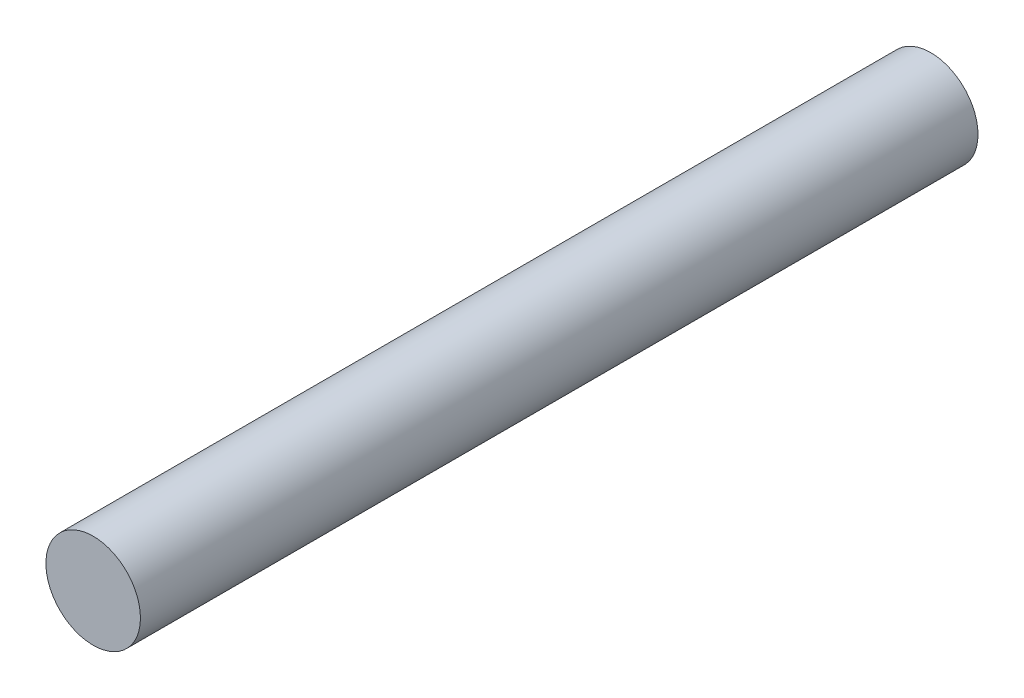
ISO-10303-21;
HEADER;
FILE_DESCRIPTION(('STEP AP214'),'2;1');
FILE_NAME('part.step','',(''),(''),'','','');
FILE_SCHEMA(('AUTOMOTIVE_DESIGN { 1 0 10303 214 1 1 1 1 }'));
ENDSEC;
DATA;
#1=APPLICATION_CONTEXT('core data for automotive mechanical design processes');
#2=APPLICATION_PROTOCOL_DEFINITION('international standard','automotive_design',2000,#1);
#3=PRODUCT_CONTEXT('',#1,'mechanical');
#4=PRODUCT('Part','Part','',(#3));
#5=PRODUCT_RELATED_PRODUCT_CATEGORY('part','',(#4));
#6=PRODUCT_DEFINITION_FORMATION('','',#4);
#7=PRODUCT_DEFINITION_CONTEXT('part definition',#1,'design');
#8=PRODUCT_DEFINITION('design','',#6,#7);
#9=PRODUCT_DEFINITION_SHAPE('','',#8);
#10=(LENGTH_UNIT() NAMED_UNIT(*) SI_UNIT(.MILLI.,.METRE.));
#11=(NAMED_UNIT(*) PLANE_ANGLE_UNIT() SI_UNIT($,.RADIAN.));
#12=(NAMED_UNIT(*) SI_UNIT($,.STERADIAN.) SOLID_ANGLE_UNIT());
#13=UNCERTAINTY_MEASURE_WITH_UNIT(LENGTH_MEASURE(1.E-05),#10,'distance_accuracy_value','');
#14=(GEOMETRIC_REPRESENTATION_CONTEXT(3) GLOBAL_UNCERTAINTY_ASSIGNED_CONTEXT((#13)) GLOBAL_UNIT_ASSIGNED_CONTEXT((#10,
#11,#12)) REPRESENTATION_CONTEXT('',''));
#15=CARTESIAN_POINT('',(0.,0.,0.));
#16=DIRECTION('',(0.,0.,1.));
#17=DIRECTION('',(1.,0.,0.));
#18=AXIS2_PLACEMENT_3D('',#15,#16,#17);
#19=CARTESIAN_POINT('',(0.,0.,44.3));
#20=DIRECTION('',(0.,0.,-1.));
#21=DIRECTION('',(-1.,0.,0.));
#22=AXIS2_PLACEMENT_3D('',#19,#20,#21);
#23=CYLINDRICAL_SURFACE('',#22,2.5);
#24=CARTESIAN_POINT('',(0.,0.,44.3));
#25=DIRECTION('',(0.,0.,1.));
#26=DIRECTION('',(1.,0.,0.));
#27=AXIS2_PLACEMENT_3D('',#24,#25,#26);
#28=CIRCLE('',#27,2.5);
#29=CARTESIAN_POINT('',(2.5,0.,44.3));
#30=VERTEX_POINT('',#29);
#31=EDGE_CURVE('E10',#30,#30,#28,.T.);
#32=ORIENTED_EDGE('',*,*,#31,.F.);
#33=EDGE_LOOP('',(#32));
#34=FACE_BOUND('',#33,.T.);
#35=CARTESIAN_POINT('',(0.,0.,0.));
#36=DIRECTION('',(0.,0.,1.));
#37=DIRECTION('',(1.,0.,0.));
#38=AXIS2_PLACEMENT_3D('',#35,#36,#37);
#39=CIRCLE('',#38,2.5);
#40=CARTESIAN_POINT('',(2.5,0.,0.));
#41=VERTEX_POINT('',#40);
#42=EDGE_CURVE('E38',#41,#41,#39,.T.);
#43=ORIENTED_EDGE('',*,*,#42,.T.);
#44=EDGE_LOOP('',(#43));
#45=FACE_BOUND('',#44,.T.);
#46=ADVANCED_FACE('F35',(#34,#45),#23,.T.);
#47=CARTESIAN_POINT('',(0.,0.,44.3));
#48=DIRECTION('',(0.,0.,1.));
#49=DIRECTION('',(1.,0.,0.));
#50=AXIS2_PLACEMENT_3D('',#47,#48,#49);
#51=PLANE('',#50);
#52=ORIENTED_EDGE('',*,*,#31,.T.);
#53=EDGE_LOOP('',(#52));
#54=FACE_BOUND('',#53,.T.);
#55=ADVANCED_FACE('F50',(#54),#51,.T.);
#56=CARTESIAN_POINT('',(0.,0.,0.));
#57=DIRECTION('',(0.,0.,1.));
#58=DIRECTION('',(1.,0.,0.));
#59=AXIS2_PLACEMENT_3D('',#56,#57,#58);
#60=PLANE('',#59);
#61=ORIENTED_EDGE('',*,*,#42,.F.);
#62=EDGE_LOOP('',(#61));
#63=FACE_BOUND('',#62,.T.);
#64=ADVANCED_FACE('F48',(#63),#60,.F.);
#65=CLOSED_SHELL('',(#46,#55,#64));
#66=MANIFOLD_SOLID_BREP('B2',#65);
#67=ADVANCED_BREP_SHAPE_REPRESENTATION('',(#18,#66),#14);
#68=SHAPE_DEFINITION_REPRESENTATION(#9,#67);
ENDSEC;
END-ISO-10303-21;
